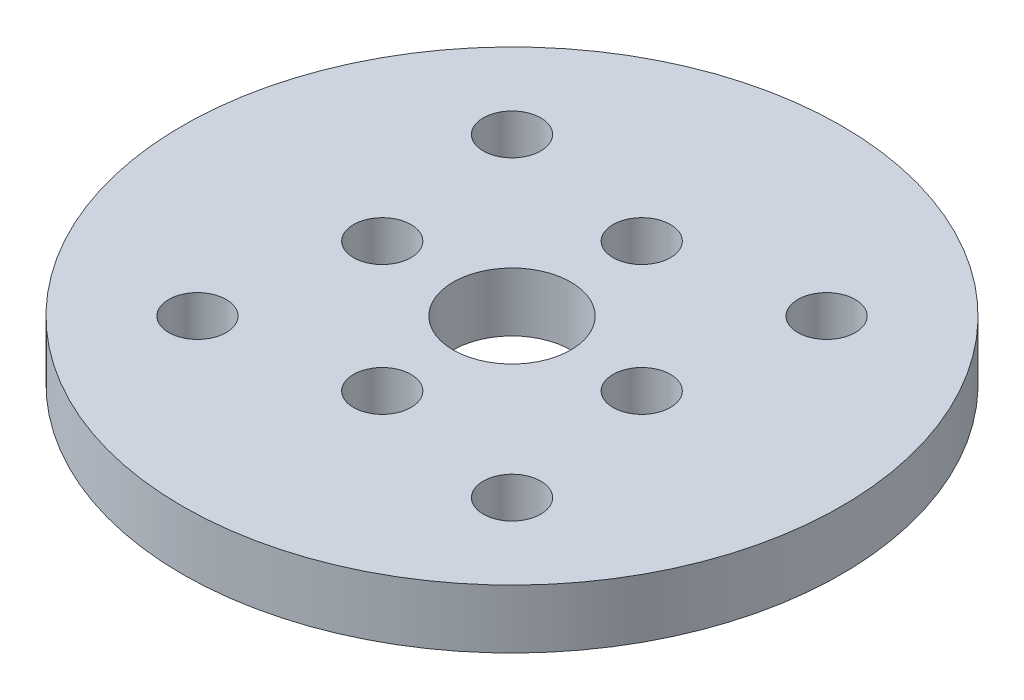
ISO-10303-21;
HEADER;
FILE_DESCRIPTION(('STEP AP214'),'2;1');
FILE_NAME('part.step','',(''),(''),'','','');
FILE_SCHEMA(('AUTOMOTIVE_DESIGN { 1 0 10303 214 1 1 1 1 }'));
ENDSEC;
DATA;
#1=APPLICATION_CONTEXT('core data for automotive mechanical design processes');
#2=APPLICATION_PROTOCOL_DEFINITION('international standard','automotive_design',2000,#1);
#3=PRODUCT_CONTEXT('',#1,'mechanical');
#4=PRODUCT('Part','Part','',(#3));
#5=PRODUCT_RELATED_PRODUCT_CATEGORY('part','',(#4));
#6=PRODUCT_DEFINITION_FORMATION('','',#4);
#7=PRODUCT_DEFINITION_CONTEXT('part definition',#1,'design');
#8=PRODUCT_DEFINITION('design','',#6,#7);
#9=PRODUCT_DEFINITION_SHAPE('','',#8);
#10=(LENGTH_UNIT() NAMED_UNIT(*) SI_UNIT(.MILLI.,.METRE.));
#11=(NAMED_UNIT(*) PLANE_ANGLE_UNIT() SI_UNIT($,.RADIAN.));
#12=(NAMED_UNIT(*) SI_UNIT($,.STERADIAN.) SOLID_ANGLE_UNIT());
#13=UNCERTAINTY_MEASURE_WITH_UNIT(LENGTH_MEASURE(1.E-05),#10,'distance_accuracy_value','');
#14=(GEOMETRIC_REPRESENTATION_CONTEXT(3) GLOBAL_UNCERTAINTY_ASSIGNED_CONTEXT((#13)) GLOBAL_UNIT_ASSIGNED_CONTEXT((#10,
#11,#12)) REPRESENTATION_CONTEXT('',''));
#15=CARTESIAN_POINT('',(0.,0.,0.));
#16=DIRECTION('',(0.,0.,1.));
#17=DIRECTION('',(1.,0.,0.));
#18=AXIS2_PLACEMENT_3D('',#15,#16,#17);
#19=CARTESIAN_POINT('',(0.,7.62,0.));
#20=DIRECTION('',(0.,1.,0.));
#21=DIRECTION('',(0.,0.,1.));
#22=AXIS2_PLACEMENT_3D('',#19,#20,#21);
#23=PLANE('',#22);
#24=CARTESIAN_POINT('',(8.48528137423856,7.62,8.48528137423858));
#25=DIRECTION('',(0.,1.,0.));
#26=DIRECTION('',(0.,0.,1.));
#27=AXIS2_PLACEMENT_3D('',#24,#25,#26);
#28=CIRCLE('',#27,1.55);
#29=CARTESIAN_POINT('',(8.48528137423856,7.62,10.0352813742386));
#30=VERTEX_POINT('',#29);
#31=EDGE_CURVE('E112',#30,#30,#28,.T.);
#32=ORIENTED_EDGE('',*,*,#31,.F.);
#33=EDGE_LOOP('',(#32));
#34=FACE_BOUND('',#33,.T.);
#35=CARTESIAN_POINT('',(-7.,7.62,0.));
#36=DIRECTION('',(0.,1.,0.));
#37=DIRECTION('',(0.,0.,1.));
#38=AXIS2_PLACEMENT_3D('',#35,#36,#37);
#39=CIRCLE('',#38,1.55);
#40=CARTESIAN_POINT('',(-7.,7.62,1.55));
#41=VERTEX_POINT('',#40);
#42=EDGE_CURVE('E96',#41,#41,#39,.T.);
#43=ORIENTED_EDGE('',*,*,#42,.F.);
#44=EDGE_LOOP('',(#43));
#45=FACE_BOUND('',#44,.T.);
#46=CARTESIAN_POINT('',(7.,7.62,0.));
#47=DIRECTION('',(0.,1.,0.));
#48=DIRECTION('',(0.,0.,1.));
#49=AXIS2_PLACEMENT_3D('',#46,#47,#48);
#50=CIRCLE('',#49,1.55);
#51=CARTESIAN_POINT('',(7.,7.62,1.55));
#52=VERTEX_POINT('',#51);
#53=EDGE_CURVE('E80',#52,#52,#50,.T.);
#54=ORIENTED_EDGE('',*,*,#53,.F.);
#55=EDGE_LOOP('',(#54));
#56=FACE_BOUND('',#55,.T.);
#57=CARTESIAN_POINT('',(-8.48528137423856,7.62,-8.48528137423858));
#58=DIRECTION('',(0.,1.,0.));
#59=DIRECTION('',(0.,0.,1.));
#60=AXIS2_PLACEMENT_3D('',#57,#58,#59);
#61=CIRCLE('',#60,1.55);
#62=CARTESIAN_POINT('',(-8.48528137423856,7.62,-6.93528137423858));
#63=VERTEX_POINT('',#62);
#64=EDGE_CURVE('E64',#63,#63,#61,.T.);
#65=ORIENTED_EDGE('',*,*,#64,.F.);
#66=EDGE_LOOP('',(#65));
#67=FACE_BOUND('',#66,.T.);
#68=CARTESIAN_POINT('',(0.,7.62,0.));
#69=DIRECTION('',(0.,1.,0.));
#70=DIRECTION('',(0.,0.,1.));
#71=AXIS2_PLACEMENT_3D('',#68,#69,#70);
#72=CIRCLE('',#71,17.78);
#73=CARTESIAN_POINT('',(0.,7.62,17.78));
#74=VERTEX_POINT('',#73);
#75=EDGE_CURVE('E10',#74,#74,#72,.T.);
#76=ORIENTED_EDGE('',*,*,#75,.T.);
#77=EDGE_LOOP('',(#76));
#78=FACE_BOUND('',#77,.T.);
#79=CARTESIAN_POINT('',(0.,7.62,0.));
#80=DIRECTION('',(0.,1.,0.));
#81=DIRECTION('',(0.,0.,1.));
#82=AXIS2_PLACEMENT_3D('',#79,#80,#81);
#83=CIRCLE('',#82,3.175);
#84=CARTESIAN_POINT('',(0.,7.62,3.175));
#85=VERTEX_POINT('',#84);
#86=EDGE_CURVE('E58',#85,#85,#83,.T.);
#87=ORIENTED_EDGE('',*,*,#86,.F.);
#88=EDGE_LOOP('',(#87));
#89=FACE_BOUND('',#88,.T.);
#90=CARTESIAN_POINT('',(0.,7.62,-7.));
#91=DIRECTION('',(0.,1.,0.));
#92=DIRECTION('',(0.,0.,1.));
#93=AXIS2_PLACEMENT_3D('',#90,#91,#92);
#94=CIRCLE('',#93,1.55);
#95=CARTESIAN_POINT('',(0.,7.62,-5.45));
#96=VERTEX_POINT('',#95);
#97=EDGE_CURVE('E72',#96,#96,#94,.T.);
#98=ORIENTED_EDGE('',*,*,#97,.F.);
#99=EDGE_LOOP('',(#98));
#100=FACE_BOUND('',#99,.T.);
#101=CARTESIAN_POINT('',(0.,7.62,7.));
#102=DIRECTION('',(0.,1.,0.));
#103=DIRECTION('',(0.,0.,1.));
#104=AXIS2_PLACEMENT_3D('',#101,#102,#103);
#105=CIRCLE('',#104,1.55);
#106=CARTESIAN_POINT('',(0.,7.62,8.55));
#107=VERTEX_POINT('',#106);
#108=EDGE_CURVE('E88',#107,#107,#105,.T.);
#109=ORIENTED_EDGE('',*,*,#108,.F.);
#110=EDGE_LOOP('',(#109));
#111=FACE_BOUND('',#110,.T.);
#112=CARTESIAN_POINT('',(8.48528137423858,7.62,-8.48528137423856));
#113=DIRECTION('',(0.,1.,0.));
#114=DIRECTION('',(0.,0.,1.));
#115=AXIS2_PLACEMENT_3D('',#112,#113,#114);
#116=CIRCLE('',#115,1.55);
#117=CARTESIAN_POINT('',(8.48528137423858,7.62,-6.93528137423856));
#118=VERTEX_POINT('',#117);
#119=EDGE_CURVE('E104',#118,#118,#116,.T.);
#120=ORIENTED_EDGE('',*,*,#119,.F.);
#121=EDGE_LOOP('',(#120));
#122=FACE_BOUND('',#121,.T.);
#123=CARTESIAN_POINT('',(-8.48528137423859,7.62,8.48528137423855));
#124=DIRECTION('',(0.,1.,0.));
#125=DIRECTION('',(0.,0.,1.));
#126=AXIS2_PLACEMENT_3D('',#123,#124,#125);
#127=CIRCLE('',#126,1.55);
#128=CARTESIAN_POINT('',(-8.48528137423859,7.62,10.0352813742386));
#129=VERTEX_POINT('',#128);
#130=EDGE_CURVE('E120',#129,#129,#127,.T.);
#131=ORIENTED_EDGE('',*,*,#130,.F.);
#132=EDGE_LOOP('',(#131));
#133=FACE_BOUND('',#132,.T.);
#134=ADVANCED_FACE('F45',(#34,#45,#56,#67,#78,#89,#100,#111,#122,#133),#23,.T.);
#135=CARTESIAN_POINT('',(0.,4.445,0.));
#136=DIRECTION('',(0.,1.,0.));
#137=DIRECTION('',(0.,0.,1.));
#138=AXIS2_PLACEMENT_3D('',#135,#136,#137);
#139=PLANE('',#138);
#140=CARTESIAN_POINT('',(0.,4.445,0.));
#141=DIRECTION('',(0.,1.,0.));
#142=DIRECTION('',(0.,0.,1.));
#143=AXIS2_PLACEMENT_3D('',#140,#141,#142);
#144=CIRCLE('',#143,17.78);
#145=CARTESIAN_POINT('',(0.,4.445,17.78));
#146=VERTEX_POINT('',#145);
#147=EDGE_CURVE('E49',#146,#146,#144,.T.);
#148=ORIENTED_EDGE('',*,*,#147,.F.);
#149=EDGE_LOOP('',(#148));
#150=FACE_BOUND('',#149,.T.);
#151=CARTESIAN_POINT('',(0.,4.445,0.));
#152=DIRECTION('',(0.,1.,0.));
#153=DIRECTION('',(0.,0.,1.));
#154=AXIS2_PLACEMENT_3D('',#151,#152,#153);
#155=CIRCLE('',#154,3.175);
#156=CARTESIAN_POINT('',(0.,4.445,3.175));
#157=VERTEX_POINT('',#156);
#158=EDGE_CURVE('E60',#157,#157,#155,.T.);
#159=ORIENTED_EDGE('',*,*,#158,.T.);
#160=EDGE_LOOP('',(#159));
#161=FACE_BOUND('',#160,.T.);
#162=CARTESIAN_POINT('',(-8.48528137423856,4.445,-8.48528137423858));
#163=DIRECTION('',(0.,1.,0.));
#164=DIRECTION('',(0.,0.,1.));
#165=AXIS2_PLACEMENT_3D('',#162,#163,#164);
#166=CIRCLE('',#165,1.55);
#167=CARTESIAN_POINT('',(-8.48528137423856,4.445,-6.93528137423858));
#168=VERTEX_POINT('',#167);
#169=EDGE_CURVE('E68',#168,#168,#166,.T.);
#170=ORIENTED_EDGE('',*,*,#169,.T.);
#171=EDGE_LOOP('',(#170));
#172=FACE_BOUND('',#171,.T.);
#173=CARTESIAN_POINT('',(0.,4.445,-7.));
#174=DIRECTION('',(0.,1.,0.));
#175=DIRECTION('',(0.,0.,1.));
#176=AXIS2_PLACEMENT_3D('',#173,#174,#175);
#177=CIRCLE('',#176,1.55);
#178=CARTESIAN_POINT('',(0.,4.445,-5.45));
#179=VERTEX_POINT('',#178);
#180=EDGE_CURVE('E76',#179,#179,#177,.T.);
#181=ORIENTED_EDGE('',*,*,#180,.T.);
#182=EDGE_LOOP('',(#181));
#183=FACE_BOUND('',#182,.T.);
#184=CARTESIAN_POINT('',(7.,4.445,0.));
#185=DIRECTION('',(0.,1.,0.));
#186=DIRECTION('',(0.,0.,1.));
#187=AXIS2_PLACEMENT_3D('',#184,#185,#186);
#188=CIRCLE('',#187,1.55);
#189=CARTESIAN_POINT('',(7.,4.445,1.55));
#190=VERTEX_POINT('',#189);
#191=EDGE_CURVE('E84',#190,#190,#188,.T.);
#192=ORIENTED_EDGE('',*,*,#191,.T.);
#193=EDGE_LOOP('',(#192));
#194=FACE_BOUND('',#193,.T.);
#195=CARTESIAN_POINT('',(0.,4.445,7.));
#196=DIRECTION('',(0.,1.,0.));
#197=DIRECTION('',(0.,0.,1.));
#198=AXIS2_PLACEMENT_3D('',#195,#196,#197);
#199=CIRCLE('',#198,1.55);
#200=CARTESIAN_POINT('',(0.,4.445,8.55));
#201=VERTEX_POINT('',#200);
#202=EDGE_CURVE('E92',#201,#201,#199,.T.);
#203=ORIENTED_EDGE('',*,*,#202,.T.);
#204=EDGE_LOOP('',(#203));
#205=FACE_BOUND('',#204,.T.);
#206=CARTESIAN_POINT('',(-7.,4.445,0.));
#207=DIRECTION('',(0.,1.,0.));
#208=DIRECTION('',(0.,0.,1.));
#209=AXIS2_PLACEMENT_3D('',#206,#207,#208);
#210=CIRCLE('',#209,1.55);
#211=CARTESIAN_POINT('',(-7.,4.445,1.55));
#212=VERTEX_POINT('',#211);
#213=EDGE_CURVE('E100',#212,#212,#210,.T.);
#214=ORIENTED_EDGE('',*,*,#213,.T.);
#215=EDGE_LOOP('',(#214));
#216=FACE_BOUND('',#215,.T.);
#217=CARTESIAN_POINT('',(8.48528137423858,4.445,-8.48528137423856));
#218=DIRECTION('',(0.,1.,0.));
#219=DIRECTION('',(0.,0.,1.));
#220=AXIS2_PLACEMENT_3D('',#217,#218,#219);
#221=CIRCLE('',#220,1.55);
#222=CARTESIAN_POINT('',(8.48528137423858,4.445,-6.93528137423856));
#223=VERTEX_POINT('',#222);
#224=EDGE_CURVE('E108',#223,#223,#221,.T.);
#225=ORIENTED_EDGE('',*,*,#224,.T.);
#226=EDGE_LOOP('',(#225));
#227=FACE_BOUND('',#226,.T.);
#228=CARTESIAN_POINT('',(8.48528137423856,4.445,8.48528137423858));
#229=DIRECTION('',(0.,1.,0.));
#230=DIRECTION('',(0.,0.,1.));
#231=AXIS2_PLACEMENT_3D('',#228,#229,#230);
#232=CIRCLE('',#231,1.55);
#233=CARTESIAN_POINT('',(8.48528137423856,4.445,10.0352813742386));
#234=VERTEX_POINT('',#233);
#235=EDGE_CURVE('E116',#234,#234,#232,.T.);
#236=ORIENTED_EDGE('',*,*,#235,.T.);
#237=EDGE_LOOP('',(#236));
#238=FACE_BOUND('',#237,.T.);
#239=CARTESIAN_POINT('',(-8.48528137423859,4.445,8.48528137423855));
#240=DIRECTION('',(0.,1.,0.));
#241=DIRECTION('',(0.,0.,1.));
#242=AXIS2_PLACEMENT_3D('',#239,#240,#241);
#243=CIRCLE('',#242,1.55);
#244=CARTESIAN_POINT('',(-8.48528137423859,4.445,10.0352813742386));
#245=VERTEX_POINT('',#244);
#246=EDGE_CURVE('E124',#245,#245,#243,.T.);
#247=ORIENTED_EDGE('',*,*,#246,.T.);
#248=EDGE_LOOP('',(#247));
#249=FACE_BOUND('',#248,.T.);
#250=ADVANCED_FACE('F136',(#150,#161,#172,#183,#194,#205,#216,#227,#238,#249),#139,.F.);
#251=CARTESIAN_POINT('',(0.,7.62,0.));
#252=DIRECTION('',(0.,-1.,0.));
#253=DIRECTION('',(0.,0.,-1.));
#254=AXIS2_PLACEMENT_3D('',#251,#252,#253);
#255=CYLINDRICAL_SURFACE('',#254,17.78);
#256=ORIENTED_EDGE('',*,*,#75,.F.);
#257=EDGE_LOOP('',(#256));
#258=FACE_BOUND('',#257,.T.);
#259=ORIENTED_EDGE('',*,*,#147,.T.);
#260=EDGE_LOOP('',(#259));
#261=FACE_BOUND('',#260,.T.);
#262=ADVANCED_FACE('F47',(#258,#261),#255,.T.);
#263=CARTESIAN_POINT('',(0.,7.62,0.));
#264=DIRECTION('',(0.,-1.,0.));
#265=DIRECTION('',(0.,0.,-1.));
#266=AXIS2_PLACEMENT_3D('',#263,#264,#265);
#267=CYLINDRICAL_SURFACE('',#266,3.175);
#268=ORIENTED_EDGE('',*,*,#86,.T.);
#269=EDGE_LOOP('',(#268));
#270=FACE_BOUND('',#269,.T.);
#271=ORIENTED_EDGE('',*,*,#158,.F.);
#272=EDGE_LOOP('',(#271));
#273=FACE_BOUND('',#272,.T.);
#274=ADVANCED_FACE('F146',(#270,#273),#267,.F.);
#275=CARTESIAN_POINT('',(-8.48528137423856,7.62,-8.48528137423858));
#276=DIRECTION('',(0.,-1.,0.));
#277=DIRECTION('',(0.,0.,-1.));
#278=AXIS2_PLACEMENT_3D('',#275,#276,#277);
#279=CYLINDRICAL_SURFACE('',#278,1.55);
#280=ORIENTED_EDGE('',*,*,#64,.T.);
#281=EDGE_LOOP('',(#280));
#282=FACE_BOUND('',#281,.T.);
#283=ORIENTED_EDGE('',*,*,#169,.F.);
#284=EDGE_LOOP('',(#283));
#285=FACE_BOUND('',#284,.T.);
#286=ADVANCED_FACE('F149',(#282,#285),#279,.F.);
#287=CARTESIAN_POINT('',(0.,7.62,-7.));
#288=DIRECTION('',(0.,-1.,0.));
#289=DIRECTION('',(0.,0.,-1.));
#290=AXIS2_PLACEMENT_3D('',#287,#288,#289);
#291=CYLINDRICAL_SURFACE('',#290,1.55);
#292=ORIENTED_EDGE('',*,*,#97,.T.);
#293=EDGE_LOOP('',(#292));
#294=FACE_BOUND('',#293,.T.);
#295=ORIENTED_EDGE('',*,*,#180,.F.);
#296=EDGE_LOOP('',(#295));
#297=FACE_BOUND('',#296,.T.);
#298=ADVANCED_FACE('F153',(#294,#297),#291,.F.);
#299=CARTESIAN_POINT('',(7.,7.62,0.));
#300=DIRECTION('',(0.,-1.,0.));
#301=DIRECTION('',(0.,0.,-1.));
#302=AXIS2_PLACEMENT_3D('',#299,#300,#301);
#303=CYLINDRICAL_SURFACE('',#302,1.55);
#304=ORIENTED_EDGE('',*,*,#53,.T.);
#305=EDGE_LOOP('',(#304));
#306=FACE_BOUND('',#305,.T.);
#307=ORIENTED_EDGE('',*,*,#191,.F.);
#308=EDGE_LOOP('',(#307));
#309=FACE_BOUND('',#308,.T.);
#310=ADVANCED_FACE('F157',(#306,#309),#303,.F.);
#311=CARTESIAN_POINT('',(0.,7.62,7.));
#312=DIRECTION('',(0.,-1.,0.));
#313=DIRECTION('',(0.,0.,-1.));
#314=AXIS2_PLACEMENT_3D('',#311,#312,#313);
#315=CYLINDRICAL_SURFACE('',#314,1.55);
#316=ORIENTED_EDGE('',*,*,#108,.T.);
#317=EDGE_LOOP('',(#316));
#318=FACE_BOUND('',#317,.T.);
#319=ORIENTED_EDGE('',*,*,#202,.F.);
#320=EDGE_LOOP('',(#319));
#321=FACE_BOUND('',#320,.T.);
#322=ADVANCED_FACE('F161',(#318,#321),#315,.F.);
#323=CARTESIAN_POINT('',(-7.,7.62,0.));
#324=DIRECTION('',(0.,-1.,0.));
#325=DIRECTION('',(0.,0.,-1.));
#326=AXIS2_PLACEMENT_3D('',#323,#324,#325);
#327=CYLINDRICAL_SURFACE('',#326,1.55);
#328=ORIENTED_EDGE('',*,*,#42,.T.);
#329=EDGE_LOOP('',(#328));
#330=FACE_BOUND('',#329,.T.);
#331=ORIENTED_EDGE('',*,*,#213,.F.);
#332=EDGE_LOOP('',(#331));
#333=FACE_BOUND('',#332,.T.);
#334=ADVANCED_FACE('F165',(#330,#333),#327,.F.);
#335=CARTESIAN_POINT('',(8.48528137423858,7.62,-8.48528137423856));
#336=DIRECTION('',(0.,-1.,0.));
#337=DIRECTION('',(0.,0.,-1.));
#338=AXIS2_PLACEMENT_3D('',#335,#336,#337);
#339=CYLINDRICAL_SURFACE('',#338,1.55);
#340=ORIENTED_EDGE('',*,*,#119,.T.);
#341=EDGE_LOOP('',(#340));
#342=FACE_BOUND('',#341,.T.);
#343=ORIENTED_EDGE('',*,*,#224,.F.);
#344=EDGE_LOOP('',(#343));
#345=FACE_BOUND('',#344,.T.);
#346=ADVANCED_FACE('F169',(#342,#345),#339,.F.);
#347=CARTESIAN_POINT('',(8.48528137423856,7.62,8.48528137423858));
#348=DIRECTION('',(0.,-1.,0.));
#349=DIRECTION('',(0.,0.,-1.));
#350=AXIS2_PLACEMENT_3D('',#347,#348,#349);
#351=CYLINDRICAL_SURFACE('',#350,1.55);
#352=ORIENTED_EDGE('',*,*,#31,.T.);
#353=EDGE_LOOP('',(#352));
#354=FACE_BOUND('',#353,.T.);
#355=ORIENTED_EDGE('',*,*,#235,.F.);
#356=EDGE_LOOP('',(#355));
#357=FACE_BOUND('',#356,.T.);
#358=ADVANCED_FACE('F173',(#354,#357),#351,.F.);
#359=CARTESIAN_POINT('',(-8.48528137423859,7.62,8.48528137423855));
#360=DIRECTION('',(0.,-1.,0.));
#361=DIRECTION('',(0.,0.,-1.));
#362=AXIS2_PLACEMENT_3D('',#359,#360,#361);
#363=CYLINDRICAL_SURFACE('',#362,1.55);
#364=ORIENTED_EDGE('',*,*,#130,.T.);
#365=EDGE_LOOP('',(#364));
#366=FACE_BOUND('',#365,.T.);
#367=ORIENTED_EDGE('',*,*,#246,.F.);
#368=EDGE_LOOP('',(#367));
#369=FACE_BOUND('',#368,.T.);
#370=ADVANCED_FACE('F132',(#366,#369),#363,.F.);
#371=CLOSED_SHELL('',(#134,#250,#262,#274,#286,#298,#310,#322,#334,#346,#358,#370));
#372=MANIFOLD_SOLID_BREP('B2',#371);
#373=ADVANCED_BREP_SHAPE_REPRESENTATION('',(#18,#372),#14);
#374=SHAPE_DEFINITION_REPRESENTATION(#9,#373);
ENDSEC;
END-ISO-10303-21;
